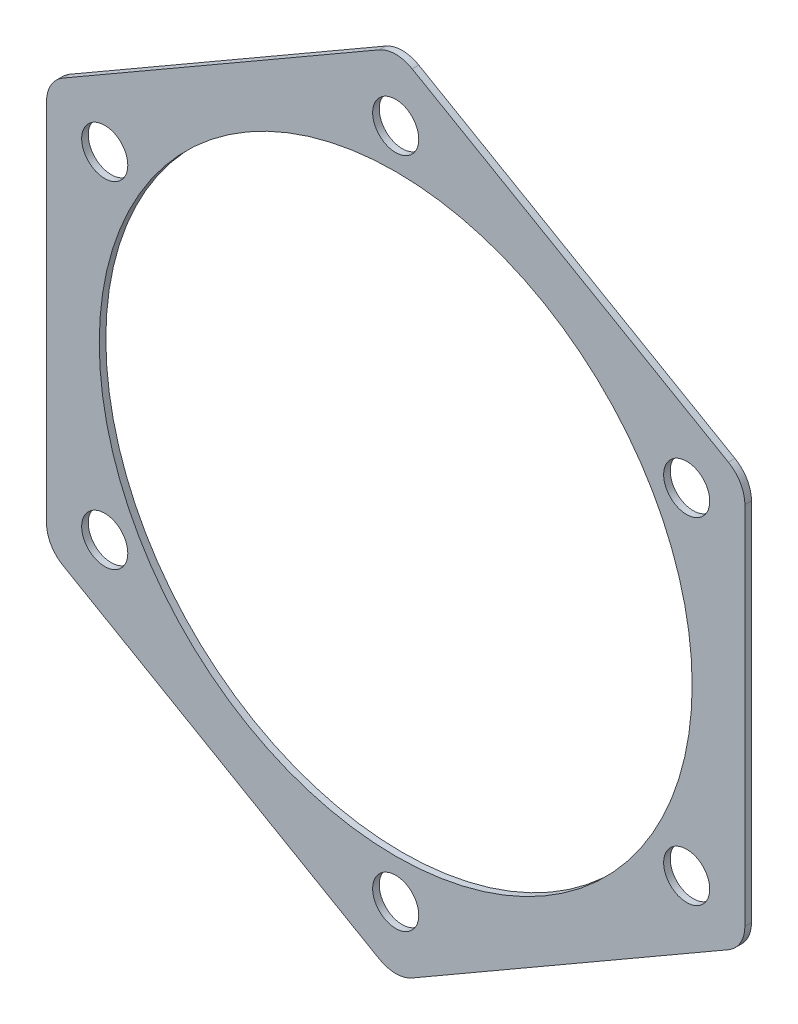
ISO-10303-21;
HEADER;
FILE_DESCRIPTION(('STEP AP214'),'2;1');
FILE_NAME('part.step','',(''),(''),'','','');
FILE_SCHEMA(('AUTOMOTIVE_DESIGN { 1 0 10303 214 1 1 1 1 }'));
ENDSEC;
DATA;
#1=APPLICATION_CONTEXT('core data for automotive mechanical design processes');
#2=APPLICATION_PROTOCOL_DEFINITION('international standard','automotive_design',2000,#1);
#3=PRODUCT_CONTEXT('',#1,'mechanical');
#4=PRODUCT('Part','Part','',(#3));
#5=PRODUCT_RELATED_PRODUCT_CATEGORY('part','',(#4));
#6=PRODUCT_DEFINITION_FORMATION('','',#4);
#7=PRODUCT_DEFINITION_CONTEXT('part definition',#1,'design');
#8=PRODUCT_DEFINITION('design','',#6,#7);
#9=PRODUCT_DEFINITION_SHAPE('','',#8);
#10=(LENGTH_UNIT() NAMED_UNIT(*) SI_UNIT(.MILLI.,.METRE.));
#11=(NAMED_UNIT(*) PLANE_ANGLE_UNIT() SI_UNIT($,.RADIAN.));
#12=(NAMED_UNIT(*) SI_UNIT($,.STERADIAN.) SOLID_ANGLE_UNIT());
#13=UNCERTAINTY_MEASURE_WITH_UNIT(LENGTH_MEASURE(1.E-05),#10,'distance_accuracy_value','');
#14=(GEOMETRIC_REPRESENTATION_CONTEXT(3) GLOBAL_UNCERTAINTY_ASSIGNED_CONTEXT((#13)) GLOBAL_UNIT_ASSIGNED_CONTEXT((#10,
#11,#12)) REPRESENTATION_CONTEXT('',''));
#15=CARTESIAN_POINT('',(0.,0.,0.));
#16=DIRECTION('',(0.,0.,1.));
#17=DIRECTION('',(1.,0.,0.));
#18=AXIS2_PLACEMENT_3D('',#15,#16,#17);
#19=CARTESIAN_POINT('',(0.,0.,1.));
#20=DIRECTION('',(0.,0.,1.));
#21=DIRECTION('',(1.,0.,0.));
#22=AXIS2_PLACEMENT_3D('',#19,#20,#21);
#23=PLANE('',#22);
#24=CARTESIAN_POINT('',(-44.1672955930064,-25.5000000000007,1.));
#25=DIRECTION('',(0.,0.,1.));
#26=DIRECTION('',(1.,0.,0.));
#27=AXIS2_PLACEMENT_3D('',#24,#25,#26);
#28=CIRCLE('',#27,3.50000000000095);
#29=CARTESIAN_POINT('',(-40.6672955930054,-25.5000000000007,1.));
#30=VERTEX_POINT('',#29);
#31=EDGE_CURVE('E322',#30,#30,#28,.T.);
#32=ORIENTED_EDGE('',*,*,#31,.F.);
#33=EDGE_LOOP('',(#32));
#34=FACE_BOUND('',#33,.T.);
#35=CARTESIAN_POINT('',(44.167295593007,-25.5000000000003,1.));
#36=DIRECTION('',(0.,0.,1.));
#37=DIRECTION('',(1.,0.,0.));
#38=AXIS2_PLACEMENT_3D('',#35,#36,#37);
#39=CIRCLE('',#38,3.50000000000005);
#40=CARTESIAN_POINT('',(47.667295593007,-25.5000000000003,1.));
#41=VERTEX_POINT('',#40);
#42=EDGE_CURVE('E306',#41,#41,#39,.T.);
#43=ORIENTED_EDGE('',*,*,#42,.F.);
#44=EDGE_LOOP('',(#43));
#45=FACE_BOUND('',#44,.T.);
#46=CARTESIAN_POINT('',(0.,51.,1.));
#47=DIRECTION('',(0.,0.,1.));
#48=DIRECTION('',(1.,0.,0.));
#49=AXIS2_PLACEMENT_3D('',#46,#47,#48);
#50=CIRCLE('',#49,3.5);
#51=CARTESIAN_POINT('',(3.5,51.,1.));
#52=VERTEX_POINT('',#51);
#53=EDGE_CURVE('E290',#52,#52,#50,.T.);
#54=ORIENTED_EDGE('',*,*,#53,.F.);
#55=EDGE_LOOP('',(#54));
#56=FACE_BOUND('',#55,.T.);
#57=DIRECTION('',(0.866025403784435,0.500000000000007,0.));
#58=VECTOR('',#57,1.);
#59=CARTESIAN_POINT('',(4.27351230460548E-13,-61.1991285341005,1.));
#60=LINE('',#59,#58);
#61=CARTESIAN_POINT('',(2.50000000000043,-59.7557528611264,1.));
#62=VERTEX_POINT('',#61);
#63=CARTESIAN_POINT('',(50.5000000000004,-32.0429399400238,1.));
#64=VERTEX_POINT('',#63);
#65=EDGE_CURVE('E271',#62,#64,#60,.T.);
#66=ORIENTED_EDGE('',*,*,#65,.T.);
#67=CARTESIAN_POINT('',(48.0000000000004,-27.7128129211017,1.));
#68=DIRECTION('',(0.,0.,1.));
#69=DIRECTION('',(1.,0.,0.));
#70=AXIS2_PLACEMENT_3D('',#67,#68,#69);
#71=CIRCLE('',#70,5.);
#72=CARTESIAN_POINT('',(53.0000000000004,-27.7128129211016,1.));
#73=VERTEX_POINT('',#72);
#74=EDGE_CURVE('E207',#64,#73,#71,.T.);
#75=ORIENTED_EDGE('',*,*,#74,.T.);
#76=DIRECTION('',(0.,1.,0.));
#77=VECTOR('',#76,1.);
#78=CARTESIAN_POINT('',(53.0000000000004,-30.5995642670498,1.));
#79=LINE('',#78,#77);
#80=CARTESIAN_POINT('',(52.9999999999998,27.7128129211028,1.));
#81=VERTEX_POINT('',#80);
#82=EDGE_CURVE('E152',#73,#81,#79,.T.);
#83=ORIENTED_EDGE('',*,*,#82,.T.);
#84=CARTESIAN_POINT('',(47.9999999999998,27.7128129211027,1.));
#85=DIRECTION('',(0.,0.,1.));
#86=DIRECTION('',(1.,0.,0.));
#87=AXIS2_PLACEMENT_3D('',#84,#85,#86);
#88=CIRCLE('',#87,5.);
#89=CARTESIAN_POINT('',(50.4999999999998,32.0429399400249,1.));
#90=VERTEX_POINT('',#89);
#91=EDGE_CURVE('E196',#81,#90,#88,.T.);
#92=ORIENTED_EDGE('',*,*,#91,.T.);
#93=DIRECTION('',(-0.866025403784442,0.499999999999995,0.));
#94=VECTOR('',#93,1.);
#95=CARTESIAN_POINT('',(52.9999999999998,30.5995642670509,1.));
#96=LINE('',#95,#94);
#97=CARTESIAN_POINT('',(2.49999999999999,59.7557528611265,1.));
#98=VERTEX_POINT('',#97);
#99=EDGE_CURVE('E162',#90,#98,#96,.T.);
#100=ORIENTED_EDGE('',*,*,#99,.T.);
#101=CARTESIAN_POINT('',(0.,55.4256258422042,1.));
#102=DIRECTION('',(0.,0.,1.));
#103=DIRECTION('',(1.,0.,0.));
#104=AXIS2_PLACEMENT_3D('',#101,#102,#103);
#105=CIRCLE('',#104,5.);
#106=CARTESIAN_POINT('',(-2.49999999999998,59.7557528611264,1.));
#107=VERTEX_POINT('',#106);
#108=EDGE_CURVE('E193',#98,#107,#105,.T.);
#109=ORIENTED_EDGE('',*,*,#108,.T.);
#110=DIRECTION('',(-0.866025403784438,-0.500000000000001,0.));
#111=VECTOR('',#110,1.);
#112=CARTESIAN_POINT('',(0.,61.1991285341005,1.));
#113=LINE('',#112,#111);
#114=CARTESIAN_POINT('',(-50.5000000000002,32.0429399400242,1.));
#115=VERTEX_POINT('',#114);
#116=EDGE_CURVE('E168',#107,#115,#113,.T.);
#117=ORIENTED_EDGE('',*,*,#116,.T.);
#118=CARTESIAN_POINT('',(-48.0000000000002,27.712812921102,1.));
#119=DIRECTION('',(0.,0.,1.));
#120=DIRECTION('',(1.,0.,0.));
#121=AXIS2_PLACEMENT_3D('',#118,#119,#120);
#122=CIRCLE('',#121,5.);
#123=CARTESIAN_POINT('',(-53.0000000000002,27.712812921102,1.));
#124=VERTEX_POINT('',#123);
#125=EDGE_CURVE('E199',#115,#124,#122,.T.);
#126=ORIENTED_EDGE('',*,*,#125,.T.);
#127=DIRECTION('',(0.,-1.,0.));
#128=VECTOR('',#127,1.);
#129=CARTESIAN_POINT('',(-53.0000000000002,30.5995642670501,1.));
#130=LINE('',#129,#128);
#131=CARTESIAN_POINT('',(-53.,-27.7128129211024,1.));
#132=VERTEX_POINT('',#131);
#133=EDGE_CURVE('E279',#124,#132,#130,.T.);
#134=ORIENTED_EDGE('',*,*,#133,.T.);
#135=CARTESIAN_POINT('',(-48.,-27.7128129211023,1.));
#136=DIRECTION('',(0.,0.,1.));
#137=DIRECTION('',(1.,0.,0.));
#138=AXIS2_PLACEMENT_3D('',#135,#136,#137);
#139=CIRCLE('',#138,5.);
#140=CARTESIAN_POINT('',(-50.5,-32.0429399400245,1.));
#141=VERTEX_POINT('',#140);
#142=EDGE_CURVE('E62',#132,#141,#139,.T.);
#143=ORIENTED_EDGE('',*,*,#142,.T.);
#144=DIRECTION('',(0.866025403784442,-0.499999999999995,0.));
#145=VECTOR('',#144,1.);
#146=CARTESIAN_POINT('',(-53.,-30.5995642670505,1.));
#147=LINE('',#146,#145);
#148=CARTESIAN_POINT('',(-2.49999999999958,-59.7557528611264,1.));
#149=VERTEX_POINT('',#148);
#150=EDGE_CURVE('E272',#141,#149,#147,.T.);
#151=ORIENTED_EDGE('',*,*,#150,.T.);
#152=CARTESIAN_POINT('',(3.92481186439753E-13,-55.4256258422042,1.));
#153=DIRECTION('',(0.,0.,1.));
#154=DIRECTION('',(1.,0.,0.));
#155=AXIS2_PLACEMENT_3D('',#152,#153,#154);
#156=CIRCLE('',#155,5.);
#157=EDGE_CURVE('E204',#149,#62,#156,.T.);
#158=ORIENTED_EDGE('',*,*,#157,.T.);
#159=EDGE_LOOP('',(#66,#75,#83,#92,#100,#109,#117,#126,#134,#143,#151,#158));
#160=FACE_BOUND('',#159,.T.);
#161=CARTESIAN_POINT('',(0.,0.,1.));
#162=DIRECTION('',(0.,0.,1.));
#163=DIRECTION('',(1.,0.,0.));
#164=AXIS2_PLACEMENT_3D('',#161,#162,#163);
#165=CIRCLE('',#164,45.);
#166=CARTESIAN_POINT('',(45.,0.,1.));
#167=VERTEX_POINT('',#166);
#168=EDGE_CURVE('E259',#167,#167,#165,.T.);
#169=ORIENTED_EDGE('',*,*,#168,.F.);
#170=EDGE_LOOP('',(#169));
#171=FACE_BOUND('',#170,.T.);
#172=CARTESIAN_POINT('',(44.1672955930068,25.5,1.));
#173=DIRECTION('',(0.,0.,1.));
#174=DIRECTION('',(1.,0.,0.));
#175=AXIS2_PLACEMENT_3D('',#172,#173,#174);
#176=CIRCLE('',#175,3.49999999999984);
#177=CARTESIAN_POINT('',(47.6672955930066,25.5,1.));
#178=VERTEX_POINT('',#177);
#179=EDGE_CURVE('E298',#178,#178,#176,.T.);
#180=ORIENTED_EDGE('',*,*,#179,.F.);
#181=EDGE_LOOP('',(#180));
#182=FACE_BOUND('',#181,.T.);
#183=CARTESIAN_POINT('',(4.02595318466835E-13,-51.0000000000007,1.));
#184=DIRECTION('',(0.,0.,1.));
#185=DIRECTION('',(1.,0.,0.));
#186=AXIS2_PLACEMENT_3D('',#183,#184,#185);
#187=CIRCLE('',#186,3.50000000000053);
#188=CARTESIAN_POINT('',(3.50000000000093,-51.0000000000007,1.));
#189=VERTEX_POINT('',#188);
#190=EDGE_CURVE('E314',#189,#189,#187,.T.);
#191=ORIENTED_EDGE('',*,*,#190,.F.);
#192=EDGE_LOOP('',(#191));
#193=FACE_BOUND('',#192,.T.);
#194=CARTESIAN_POINT('',(-44.1672955930066,25.4999999999996,1.));
#195=DIRECTION('',(0.,0.,1.));
#196=DIRECTION('',(1.,0.,0.));
#197=AXIS2_PLACEMENT_3D('',#194,#195,#196);
#198=CIRCLE('',#197,3.50000000000096);
#199=CARTESIAN_POINT('',(-40.6672955930056,25.4999999999996,1.));
#200=VERTEX_POINT('',#199);
#201=EDGE_CURVE('E330',#200,#200,#198,.T.);
#202=ORIENTED_EDGE('',*,*,#201,.F.);
#203=EDGE_LOOP('',(#202));
#204=FACE_BOUND('',#203,.T.);
#205=ADVANCED_FACE('F39',(#34,#45,#56,#160,#171,#182,#193,#204),#23,.T.);
#206=CARTESIAN_POINT('',(0.,0.,0.));
#207=DIRECTION('',(0.,0.,1.));
#208=DIRECTION('',(1.,0.,0.));
#209=AXIS2_PLACEMENT_3D('',#206,#207,#208);
#210=PLANE('',#209);
#211=DIRECTION('',(0.,1.,0.));
#212=VECTOR('',#211,1.);
#213=CARTESIAN_POINT('',(53.0000000000004,-30.5995642670498,0.));
#214=LINE('',#213,#212);
#215=CARTESIAN_POINT('',(53.0000000000004,-27.7128129211016,0.));
#216=VERTEX_POINT('',#215);
#217=CARTESIAN_POINT('',(52.9999999999998,27.7128129211028,0.));
#218=VERTEX_POINT('',#217);
#219=EDGE_CURVE('E149',#216,#218,#214,.T.);
#220=ORIENTED_EDGE('',*,*,#219,.F.);
#221=CARTESIAN_POINT('',(48.0000000000004,-27.7128129211017,0.));
#222=DIRECTION('',(0.,0.,1.));
#223=DIRECTION('',(1.,0.,0.));
#224=AXIS2_PLACEMENT_3D('',#221,#222,#223);
#225=CIRCLE('',#224,5.);
#226=CARTESIAN_POINT('',(50.5000000000004,-32.0429399400238,0.));
#227=VERTEX_POINT('',#226);
#228=EDGE_CURVE('E131',#216,#227,#225,.F.);
#229=ORIENTED_EDGE('',*,*,#228,.T.);
#230=DIRECTION('',(0.866025403784435,0.500000000000007,0.));
#231=VECTOR('',#230,1.);
#232=CARTESIAN_POINT('',(4.27351230460548E-13,-61.1991285341005,0.));
#233=LINE('',#232,#231);
#234=CARTESIAN_POINT('',(2.50000000000043,-59.7557528611264,0.));
#235=VERTEX_POINT('',#234);
#236=EDGE_CURVE('E163',#235,#227,#233,.T.);
#237=ORIENTED_EDGE('',*,*,#236,.F.);
#238=CARTESIAN_POINT('',(3.92481186439753E-13,-55.4256258422042,0.));
#239=DIRECTION('',(0.,0.,1.));
#240=DIRECTION('',(1.,0.,0.));
#241=AXIS2_PLACEMENT_3D('',#238,#239,#240);
#242=CIRCLE('',#241,5.);
#243=CARTESIAN_POINT('',(-2.49999999999958,-59.7557528611264,0.));
#244=VERTEX_POINT('',#243);
#245=EDGE_CURVE('E143',#235,#244,#242,.F.);
#246=ORIENTED_EDGE('',*,*,#245,.T.);
#247=DIRECTION('',(0.866025403784442,-0.499999999999995,0.));
#248=VECTOR('',#247,1.);
#249=CARTESIAN_POINT('',(-53.,-30.5995642670505,0.));
#250=LINE('',#249,#248);
#251=CARTESIAN_POINT('',(-50.5,-32.0429399400245,0.));
#252=VERTEX_POINT('',#251);
#253=EDGE_CURVE('E170',#252,#244,#250,.T.);
#254=ORIENTED_EDGE('',*,*,#253,.F.);
#255=CARTESIAN_POINT('',(-48.,-27.7128129211023,0.));
#256=DIRECTION('',(0.,0.,1.));
#257=DIRECTION('',(1.,0.,0.));
#258=AXIS2_PLACEMENT_3D('',#255,#256,#257);
#259=CIRCLE('',#258,5.);
#260=CARTESIAN_POINT('',(-53.,-27.7128129211024,0.));
#261=VERTEX_POINT('',#260);
#262=EDGE_CURVE('E183',#252,#261,#259,.F.);
#263=ORIENTED_EDGE('',*,*,#262,.T.);
#264=DIRECTION('',(0.,-1.,0.));
#265=VECTOR('',#264,1.);
#266=CARTESIAN_POINT('',(-53.0000000000002,30.5995642670501,0.));
#267=LINE('',#266,#265);
#268=CARTESIAN_POINT('',(-53.0000000000002,27.712812921102,0.));
#269=VERTEX_POINT('',#268);
#270=EDGE_CURVE('E253',#269,#261,#267,.T.);
#271=ORIENTED_EDGE('',*,*,#270,.F.);
#272=CARTESIAN_POINT('',(-48.0000000000002,27.712812921102,0.));
#273=DIRECTION('',(0.,0.,1.));
#274=DIRECTION('',(1.,0.,0.));
#275=AXIS2_PLACEMENT_3D('',#272,#273,#274);
#276=CIRCLE('',#275,5.);
#277=CARTESIAN_POINT('',(-50.5000000000002,32.0429399400242,0.));
#278=VERTEX_POINT('',#277);
#279=EDGE_CURVE('E180',#269,#278,#276,.F.);
#280=ORIENTED_EDGE('',*,*,#279,.T.);
#281=DIRECTION('',(-0.866025403784438,-0.500000000000001,0.));
#282=VECTOR('',#281,1.);
#283=CARTESIAN_POINT('',(0.,61.1991285341005,0.));
#284=LINE('',#283,#282);
#285=CARTESIAN_POINT('',(-2.49999999999998,59.7557528611264,0.));
#286=VERTEX_POINT('',#285);
#287=EDGE_CURVE('E249',#286,#278,#284,.T.);
#288=ORIENTED_EDGE('',*,*,#287,.F.);
#289=CARTESIAN_POINT('',(0.,55.4256258422042,0.));
#290=DIRECTION('',(0.,0.,1.));
#291=DIRECTION('',(1.,0.,0.));
#292=AXIS2_PLACEMENT_3D('',#289,#290,#291);
#293=CIRCLE('',#292,5.);
#294=CARTESIAN_POINT('',(2.49999999999999,59.7557528611265,0.));
#295=VERTEX_POINT('',#294);
#296=EDGE_CURVE('E154',#286,#295,#293,.F.);
#297=ORIENTED_EDGE('',*,*,#296,.T.);
#298=DIRECTION('',(-0.866025403784442,0.499999999999995,0.));
#299=VECTOR('',#298,1.);
#300=CARTESIAN_POINT('',(52.9999999999998,30.5995642670509,0.));
#301=LINE('',#300,#299);
#302=CARTESIAN_POINT('',(50.4999999999998,32.0429399400249,0.));
#303=VERTEX_POINT('',#302);
#304=EDGE_CURVE('E236',#303,#295,#301,.T.);
#305=ORIENTED_EDGE('',*,*,#304,.F.);
#306=CARTESIAN_POINT('',(47.9999999999998,27.7128129211027,0.));
#307=DIRECTION('',(0.,0.,1.));
#308=DIRECTION('',(1.,0.,0.));
#309=AXIS2_PLACEMENT_3D('',#306,#307,#308);
#310=CIRCLE('',#309,5.);
#311=EDGE_CURVE('E160',#303,#218,#310,.F.);
#312=ORIENTED_EDGE('',*,*,#311,.T.);
#313=EDGE_LOOP('',(#220,#229,#237,#246,#254,#263,#271,#280,#288,#297,#305,#312));
#314=FACE_BOUND('',#313,.T.);
#315=CARTESIAN_POINT('',(0.,0.,0.));
#316=DIRECTION('',(0.,0.,1.));
#317=DIRECTION('',(1.,0.,0.));
#318=AXIS2_PLACEMENT_3D('',#315,#316,#317);
#319=CIRCLE('',#318,45.);
#320=CARTESIAN_POINT('',(45.,0.,0.));
#321=VERTEX_POINT('',#320);
#322=EDGE_CURVE('E286',#321,#321,#319,.T.);
#323=ORIENTED_EDGE('',*,*,#322,.T.);
#324=EDGE_LOOP('',(#323));
#325=FACE_BOUND('',#324,.T.);
#326=CARTESIAN_POINT('',(0.,51.,0.));
#327=DIRECTION('',(0.,0.,1.));
#328=DIRECTION('',(1.,0.,0.));
#329=AXIS2_PLACEMENT_3D('',#326,#327,#328);
#330=CIRCLE('',#329,3.5);
#331=CARTESIAN_POINT('',(3.5,51.,0.));
#332=VERTEX_POINT('',#331);
#333=EDGE_CURVE('E294',#332,#332,#330,.T.);
#334=ORIENTED_EDGE('',*,*,#333,.T.);
#335=EDGE_LOOP('',(#334));
#336=FACE_BOUND('',#335,.T.);
#337=CARTESIAN_POINT('',(44.1672955930068,25.5,0.));
#338=DIRECTION('',(0.,0.,1.));
#339=DIRECTION('',(1.,0.,0.));
#340=AXIS2_PLACEMENT_3D('',#337,#338,#339);
#341=CIRCLE('',#340,3.49999999999984);
#342=CARTESIAN_POINT('',(47.6672955930066,25.5,0.));
#343=VERTEX_POINT('',#342);
#344=EDGE_CURVE('E302',#343,#343,#341,.T.);
#345=ORIENTED_EDGE('',*,*,#344,.T.);
#346=EDGE_LOOP('',(#345));
#347=FACE_BOUND('',#346,.T.);
#348=CARTESIAN_POINT('',(44.167295593007,-25.5000000000003,0.));
#349=DIRECTION('',(0.,0.,1.));
#350=DIRECTION('',(1.,0.,0.));
#351=AXIS2_PLACEMENT_3D('',#348,#349,#350);
#352=CIRCLE('',#351,3.50000000000005);
#353=CARTESIAN_POINT('',(47.667295593007,-25.5000000000003,0.));
#354=VERTEX_POINT('',#353);
#355=EDGE_CURVE('E310',#354,#354,#352,.T.);
#356=ORIENTED_EDGE('',*,*,#355,.T.);
#357=EDGE_LOOP('',(#356));
#358=FACE_BOUND('',#357,.T.);
#359=CARTESIAN_POINT('',(4.02595318466835E-13,-51.0000000000007,0.));
#360=DIRECTION('',(0.,0.,1.));
#361=DIRECTION('',(1.,0.,0.));
#362=AXIS2_PLACEMENT_3D('',#359,#360,#361);
#363=CIRCLE('',#362,3.50000000000053);
#364=CARTESIAN_POINT('',(3.50000000000093,-51.0000000000007,0.));
#365=VERTEX_POINT('',#364);
#366=EDGE_CURVE('E318',#365,#365,#363,.T.);
#367=ORIENTED_EDGE('',*,*,#366,.T.);
#368=EDGE_LOOP('',(#367));
#369=FACE_BOUND('',#368,.T.);
#370=CARTESIAN_POINT('',(-44.1672955930064,-25.5000000000007,0.));
#371=DIRECTION('',(0.,0.,1.));
#372=DIRECTION('',(1.,0.,0.));
#373=AXIS2_PLACEMENT_3D('',#370,#371,#372);
#374=CIRCLE('',#373,3.50000000000095);
#375=CARTESIAN_POINT('',(-40.6672955930054,-25.5000000000007,0.));
#376=VERTEX_POINT('',#375);
#377=EDGE_CURVE('E326',#376,#376,#374,.T.);
#378=ORIENTED_EDGE('',*,*,#377,.T.);
#379=EDGE_LOOP('',(#378));
#380=FACE_BOUND('',#379,.T.);
#381=CARTESIAN_POINT('',(-44.1672955930066,25.4999999999996,0.));
#382=DIRECTION('',(0.,0.,1.));
#383=DIRECTION('',(1.,0.,0.));
#384=AXIS2_PLACEMENT_3D('',#381,#382,#383);
#385=CIRCLE('',#384,3.50000000000096);
#386=CARTESIAN_POINT('',(-40.6672955930056,25.4999999999996,0.));
#387=VERTEX_POINT('',#386);
#388=EDGE_CURVE('E334',#387,#387,#385,.T.);
#389=ORIENTED_EDGE('',*,*,#388,.T.);
#390=EDGE_LOOP('',(#389));
#391=FACE_BOUND('',#390,.T.);
#392=ADVANCED_FACE('F157',(#314,#325,#336,#347,#358,#369,#380,#391),#210,.F.);
#393=CARTESIAN_POINT('',(52.9999999999998,30.5995642670509,1.));
#394=DIRECTION('',(-0.499999999999995,-0.866025403784442,0.));
#395=DIRECTION('',(0.866025403784442,-0.499999999999995,0.));
#396=AXIS2_PLACEMENT_3D('',#393,#394,#395);
#397=PLANE('',#396);
#398=ORIENTED_EDGE('',*,*,#99,.F.);
#399=DIRECTION('',(0.,0.,-1.));
#400=VECTOR('',#399,1.);
#401=CARTESIAN_POINT('',(50.4999999999998,32.0429399400249,1.));
#402=LINE('',#401,#400);
#403=EDGE_CURVE('E11',#90,#303,#402,.T.);
#404=ORIENTED_EDGE('',*,*,#403,.T.);
#405=ORIENTED_EDGE('',*,*,#304,.T.);
#406=DIRECTION('',(0.,0.,-1.));
#407=VECTOR('',#406,1.);
#408=CARTESIAN_POINT('',(2.49999999999999,59.7557528611265,1.));
#409=LINE('',#408,#407);
#410=EDGE_CURVE('E48',#295,#98,#409,.F.);
#411=ORIENTED_EDGE('',*,*,#410,.T.);
#412=EDGE_LOOP('',(#398,#404,#405,#411));
#413=FACE_BOUND('',#412,.T.);
#414=ADVANCED_FACE('F234',(#413),#397,.F.);
#415=CARTESIAN_POINT('',(0.,61.1991285341005,1.));
#416=DIRECTION('',(0.500000000000001,-0.866025403784438,0.));
#417=DIRECTION('',(0.866025403784438,0.500000000000001,0.));
#418=AXIS2_PLACEMENT_3D('',#415,#416,#417);
#419=PLANE('',#418);
#420=ORIENTED_EDGE('',*,*,#287,.T.);
#421=DIRECTION('',(0.,0.,-1.));
#422=VECTOR('',#421,1.);
#423=CARTESIAN_POINT('',(-50.5000000000002,32.0429399400242,1.));
#424=LINE('',#423,#422);
#425=EDGE_CURVE('E227',#278,#115,#424,.F.);
#426=ORIENTED_EDGE('',*,*,#425,.T.);
#427=ORIENTED_EDGE('',*,*,#116,.F.);
#428=DIRECTION('',(0.,0.,-1.));
#429=VECTOR('',#428,1.);
#430=CARTESIAN_POINT('',(-2.49999999999998,59.7557528611264,1.));
#431=LINE('',#430,#429);
#432=EDGE_CURVE('E223',#107,#286,#431,.T.);
#433=ORIENTED_EDGE('',*,*,#432,.T.);
#434=EDGE_LOOP('',(#420,#426,#427,#433));
#435=FACE_BOUND('',#434,.T.);
#436=ADVANCED_FACE('F248',(#435),#419,.F.);
#437=CARTESIAN_POINT('',(-53.0000000000002,30.5995642670501,1.));
#438=DIRECTION('',(1.,0.,0.));
#439=DIRECTION('',(0.,1.,0.));
#440=AXIS2_PLACEMENT_3D('',#437,#438,#439);
#441=PLANE('',#440);
#442=ORIENTED_EDGE('',*,*,#270,.T.);
#443=DIRECTION('',(0.,0.,-1.));
#444=VECTOR('',#443,1.);
#445=CARTESIAN_POINT('',(-53.,-27.7128129211024,1.));
#446=LINE('',#445,#444);
#447=EDGE_CURVE('E220',#261,#132,#446,.F.);
#448=ORIENTED_EDGE('',*,*,#447,.T.);
#449=ORIENTED_EDGE('',*,*,#133,.F.);
#450=DIRECTION('',(0.,0.,-1.));
#451=VECTOR('',#450,1.);
#452=CARTESIAN_POINT('',(-53.0000000000002,27.712812921102,1.));
#453=LINE('',#452,#451);
#454=EDGE_CURVE('E216',#124,#269,#453,.T.);
#455=ORIENTED_EDGE('',*,*,#454,.T.);
#456=EDGE_LOOP('',(#442,#448,#449,#455));
#457=FACE_BOUND('',#456,.T.);
#458=ADVANCED_FACE('F364',(#457),#441,.F.);
#459=CARTESIAN_POINT('',(-53.,-30.5995642670505,1.));
#460=DIRECTION('',(0.499999999999995,0.866025403784442,0.));
#461=DIRECTION('',(-0.866025403784442,0.499999999999995,0.));
#462=AXIS2_PLACEMENT_3D('',#459,#460,#461);
#463=PLANE('',#462);
#464=ORIENTED_EDGE('',*,*,#253,.T.);
#465=DIRECTION('',(0.,0.,-1.));
#466=VECTOR('',#465,1.);
#467=CARTESIAN_POINT('',(-2.49999999999958,-59.7557528611264,1.));
#468=LINE('',#467,#466);
#469=EDGE_CURVE('E55',#244,#149,#468,.F.);
#470=ORIENTED_EDGE('',*,*,#469,.T.);
#471=ORIENTED_EDGE('',*,*,#150,.F.);
#472=DIRECTION('',(0.,0.,-1.));
#473=VECTOR('',#472,1.);
#474=CARTESIAN_POINT('',(-50.5,-32.0429399400245,1.));
#475=LINE('',#474,#473);
#476=EDGE_CURVE('E210',#141,#252,#475,.T.);
#477=ORIENTED_EDGE('',*,*,#476,.T.);
#478=EDGE_LOOP('',(#464,#470,#471,#477));
#479=FACE_BOUND('',#478,.T.);
#480=ADVANCED_FACE('F264',(#479),#463,.F.);
#481=CARTESIAN_POINT('',(4.27351230460548E-13,-61.1991285341005,1.));
#482=DIRECTION('',(-0.500000000000007,0.866025403784435,0.));
#483=DIRECTION('',(-0.866025403784435,-0.500000000000007,0.));
#484=AXIS2_PLACEMENT_3D('',#481,#482,#483);
#485=PLANE('',#484);
#486=ORIENTED_EDGE('',*,*,#236,.T.);
#487=DIRECTION('',(0.,0.,-1.));
#488=VECTOR('',#487,1.);
#489=CARTESIAN_POINT('',(50.5000000000004,-32.0429399400238,1.));
#490=LINE('',#489,#488);
#491=EDGE_CURVE('E136',#227,#64,#490,.F.);
#492=ORIENTED_EDGE('',*,*,#491,.T.);
#493=ORIENTED_EDGE('',*,*,#65,.F.);
#494=DIRECTION('',(0.,0.,-1.));
#495=VECTOR('',#494,1.);
#496=CARTESIAN_POINT('',(2.50000000000043,-59.7557528611264,1.));
#497=LINE('',#496,#495);
#498=EDGE_CURVE('E142',#62,#235,#497,.T.);
#499=ORIENTED_EDGE('',*,*,#498,.T.);
#500=EDGE_LOOP('',(#486,#492,#493,#499));
#501=FACE_BOUND('',#500,.T.);
#502=ADVANCED_FACE('F274',(#501),#485,.F.);
#503=CARTESIAN_POINT('',(53.0000000000004,-30.5995642670498,1.));
#504=DIRECTION('',(-1.,0.,0.));
#505=DIRECTION('',(0.,-1.,0.));
#506=AXIS2_PLACEMENT_3D('',#503,#504,#505);
#507=PLANE('',#506);
#508=ORIENTED_EDGE('',*,*,#82,.F.);
#509=DIRECTION('',(0.,0.,-1.));
#510=VECTOR('',#509,1.);
#511=CARTESIAN_POINT('',(53.0000000000004,-27.7128129211016,1.));
#512=LINE('',#511,#510);
#513=EDGE_CURVE('E135',#73,#216,#512,.T.);
#514=ORIENTED_EDGE('',*,*,#513,.T.);
#515=ORIENTED_EDGE('',*,*,#219,.T.);
#516=DIRECTION('',(0.,0.,-1.));
#517=VECTOR('',#516,1.);
#518=CARTESIAN_POINT('',(52.9999999999998,27.7128129211028,1.));
#519=LINE('',#518,#517);
#520=EDGE_CURVE('E155',#218,#81,#519,.F.);
#521=ORIENTED_EDGE('',*,*,#520,.T.);
#522=EDGE_LOOP('',(#508,#514,#515,#521));
#523=FACE_BOUND('',#522,.T.);
#524=ADVANCED_FACE('F148',(#523),#507,.F.);
#525=CARTESIAN_POINT('',(0.,0.,1.));
#526=DIRECTION('',(0.,0.,-1.));
#527=DIRECTION('',(-1.,0.,0.));
#528=AXIS2_PLACEMENT_3D('',#525,#526,#527);
#529=CYLINDRICAL_SURFACE('',#528,45.);
#530=ORIENTED_EDGE('',*,*,#168,.T.);
#531=EDGE_LOOP('',(#530));
#532=FACE_BOUND('',#531,.T.);
#533=ORIENTED_EDGE('',*,*,#322,.F.);
#534=EDGE_LOOP('',(#533));
#535=FACE_BOUND('',#534,.T.);
#536=ADVANCED_FACE('F355',(#532,#535),#529,.F.);
#537=CARTESIAN_POINT('',(0.,51.,1.));
#538=DIRECTION('',(0.,0.,-1.));
#539=DIRECTION('',(-1.,0.,0.));
#540=AXIS2_PLACEMENT_3D('',#537,#538,#539);
#541=CYLINDRICAL_SURFACE('',#540,3.5);
#542=ORIENTED_EDGE('',*,*,#53,.T.);
#543=EDGE_LOOP('',(#542));
#544=FACE_BOUND('',#543,.T.);
#545=ORIENTED_EDGE('',*,*,#333,.F.);
#546=EDGE_LOOP('',(#545));
#547=FACE_BOUND('',#546,.T.);
#548=ADVANCED_FACE('F515',(#544,#547),#541,.F.);
#549=CARTESIAN_POINT('',(44.1672955930068,25.5,1.));
#550=DIRECTION('',(0.,0.,-1.));
#551=DIRECTION('',(-1.,0.,0.));
#552=AXIS2_PLACEMENT_3D('',#549,#550,#551);
#553=CYLINDRICAL_SURFACE('',#552,3.49999999999984);
#554=ORIENTED_EDGE('',*,*,#179,.T.);
#555=EDGE_LOOP('',(#554));
#556=FACE_BOUND('',#555,.T.);
#557=ORIENTED_EDGE('',*,*,#344,.F.);
#558=EDGE_LOOP('',(#557));
#559=FACE_BOUND('',#558,.T.);
#560=ADVANCED_FACE('F505',(#556,#559),#553,.F.);
#561=CARTESIAN_POINT('',(44.167295593007,-25.5000000000003,1.));
#562=DIRECTION('',(0.,0.,-1.));
#563=DIRECTION('',(-1.,0.,0.));
#564=AXIS2_PLACEMENT_3D('',#561,#562,#563);
#565=CYLINDRICAL_SURFACE('',#564,3.50000000000005);
#566=ORIENTED_EDGE('',*,*,#42,.T.);
#567=EDGE_LOOP('',(#566));
#568=FACE_BOUND('',#567,.T.);
#569=ORIENTED_EDGE('',*,*,#355,.F.);
#570=EDGE_LOOP('',(#569));
#571=FACE_BOUND('',#570,.T.);
#572=ADVANCED_FACE('F495',(#568,#571),#565,.F.);
#573=CARTESIAN_POINT('',(4.02595318466835E-13,-51.0000000000007,1.));
#574=DIRECTION('',(0.,0.,-1.));
#575=DIRECTION('',(-1.,0.,0.));
#576=AXIS2_PLACEMENT_3D('',#573,#574,#575);
#577=CYLINDRICAL_SURFACE('',#576,3.50000000000053);
#578=ORIENTED_EDGE('',*,*,#190,.T.);
#579=EDGE_LOOP('',(#578));
#580=FACE_BOUND('',#579,.T.);
#581=ORIENTED_EDGE('',*,*,#366,.F.);
#582=EDGE_LOOP('',(#581));
#583=FACE_BOUND('',#582,.T.);
#584=ADVANCED_FACE('F485',(#580,#583),#577,.F.);
#585=CARTESIAN_POINT('',(-44.1672955930064,-25.5000000000007,1.));
#586=DIRECTION('',(0.,0.,-1.));
#587=DIRECTION('',(-1.,0.,0.));
#588=AXIS2_PLACEMENT_3D('',#585,#586,#587);
#589=CYLINDRICAL_SURFACE('',#588,3.50000000000095);
#590=ORIENTED_EDGE('',*,*,#31,.T.);
#591=EDGE_LOOP('',(#590));
#592=FACE_BOUND('',#591,.T.);
#593=ORIENTED_EDGE('',*,*,#377,.F.);
#594=EDGE_LOOP('',(#593));
#595=FACE_BOUND('',#594,.T.);
#596=ADVANCED_FACE('F476',(#592,#595),#589,.F.);
#597=CARTESIAN_POINT('',(-44.1672955930066,25.4999999999996,1.));
#598=DIRECTION('',(0.,0.,-1.));
#599=DIRECTION('',(-1.,0.,0.));
#600=AXIS2_PLACEMENT_3D('',#597,#598,#599);
#601=CYLINDRICAL_SURFACE('',#600,3.50000000000096);
#602=ORIENTED_EDGE('',*,*,#201,.T.);
#603=EDGE_LOOP('',(#602));
#604=FACE_BOUND('',#603,.T.);
#605=ORIENTED_EDGE('',*,*,#388,.F.);
#606=EDGE_LOOP('',(#605));
#607=FACE_BOUND('',#606,.T.);
#608=ADVANCED_FACE('F342',(#604,#607),#601,.F.);
#609=CARTESIAN_POINT('',(48.0000000000004,-27.7128129211017,1.));
#610=DIRECTION('',(0.,0.,-1.));
#611=DIRECTION('',(-1.,0.,0.));
#612=AXIS2_PLACEMENT_3D('',#609,#610,#611);
#613=CYLINDRICAL_SURFACE('',#612,5.);
#614=ORIENTED_EDGE('',*,*,#74,.F.);
#615=ORIENTED_EDGE('',*,*,#491,.F.);
#616=ORIENTED_EDGE('',*,*,#228,.F.);
#617=ORIENTED_EDGE('',*,*,#513,.F.);
#618=EDGE_LOOP('',(#614,#615,#616,#617));
#619=FACE_BOUND('',#618,.T.);
#620=ADVANCED_FACE('F134',(#619),#613,.T.);
#621=CARTESIAN_POINT('',(3.92481186439753E-13,-55.4256258422042,1.));
#622=DIRECTION('',(0.,0.,-1.));
#623=DIRECTION('',(-1.,0.,0.));
#624=AXIS2_PLACEMENT_3D('',#621,#622,#623);
#625=CYLINDRICAL_SURFACE('',#624,5.);
#626=ORIENTED_EDGE('',*,*,#157,.F.);
#627=ORIENTED_EDGE('',*,*,#469,.F.);
#628=ORIENTED_EDGE('',*,*,#245,.F.);
#629=ORIENTED_EDGE('',*,*,#498,.F.);
#630=EDGE_LOOP('',(#626,#627,#628,#629));
#631=FACE_BOUND('',#630,.T.);
#632=ADVANCED_FACE('F268',(#631),#625,.T.);
#633=CARTESIAN_POINT('',(-48.,-27.7128129211023,1.));
#634=DIRECTION('',(0.,0.,-1.));
#635=DIRECTION('',(-1.,0.,0.));
#636=AXIS2_PLACEMENT_3D('',#633,#634,#635);
#637=CYLINDRICAL_SURFACE('',#636,5.);
#638=ORIENTED_EDGE('',*,*,#142,.F.);
#639=ORIENTED_EDGE('',*,*,#447,.F.);
#640=ORIENTED_EDGE('',*,*,#262,.F.);
#641=ORIENTED_EDGE('',*,*,#476,.F.);
#642=EDGE_LOOP('',(#638,#639,#640,#641));
#643=FACE_BOUND('',#642,.T.);
#644=ADVANCED_FACE('F376',(#643),#637,.T.);
#645=CARTESIAN_POINT('',(-48.0000000000002,27.712812921102,1.));
#646=DIRECTION('',(0.,0.,-1.));
#647=DIRECTION('',(-1.,0.,0.));
#648=AXIS2_PLACEMENT_3D('',#645,#646,#647);
#649=CYLINDRICAL_SURFACE('',#648,5.);
#650=ORIENTED_EDGE('',*,*,#125,.F.);
#651=ORIENTED_EDGE('',*,*,#425,.F.);
#652=ORIENTED_EDGE('',*,*,#279,.F.);
#653=ORIENTED_EDGE('',*,*,#454,.F.);
#654=EDGE_LOOP('',(#650,#651,#652,#653));
#655=FACE_BOUND('',#654,.T.);
#656=ADVANCED_FACE('F379',(#655),#649,.T.);
#657=CARTESIAN_POINT('',(47.9999999999998,27.7128129211027,1.));
#658=DIRECTION('',(0.,0.,-1.));
#659=DIRECTION('',(-1.,0.,0.));
#660=AXIS2_PLACEMENT_3D('',#657,#658,#659);
#661=CYLINDRICAL_SURFACE('',#660,5.);
#662=ORIENTED_EDGE('',*,*,#91,.F.);
#663=ORIENTED_EDGE('',*,*,#520,.F.);
#664=ORIENTED_EDGE('',*,*,#311,.F.);
#665=ORIENTED_EDGE('',*,*,#403,.F.);
#666=EDGE_LOOP('',(#662,#663,#664,#665));
#667=FACE_BOUND('',#666,.T.);
#668=ADVANCED_FACE('F382',(#667),#661,.T.);
#669=CARTESIAN_POINT('',(0.,55.4256258422042,1.));
#670=DIRECTION('',(0.,0.,-1.));
#671=DIRECTION('',(-1.,0.,0.));
#672=AXIS2_PLACEMENT_3D('',#669,#670,#671);
#673=CYLINDRICAL_SURFACE('',#672,5.);
#674=ORIENTED_EDGE('',*,*,#108,.F.);
#675=ORIENTED_EDGE('',*,*,#410,.F.);
#676=ORIENTED_EDGE('',*,*,#296,.F.);
#677=ORIENTED_EDGE('',*,*,#432,.F.);
#678=EDGE_LOOP('',(#674,#675,#676,#677));
#679=FACE_BOUND('',#678,.T.);
#680=ADVANCED_FACE('F41',(#679),#673,.T.);
#681=CLOSED_SHELL('',(#205,#392,#414,#436,#458,#480,#502,#524,#536,#548,#560,#572,#584,#596,
#608,#620,#632,#644,#656,#668,#680));
#682=MANIFOLD_SOLID_BREP('B2',#681);
#683=ADVANCED_BREP_SHAPE_REPRESENTATION('',(#18,#682),#14);
#684=SHAPE_DEFINITION_REPRESENTATION(#9,#683);
ENDSEC;
END-ISO-10303-21;
